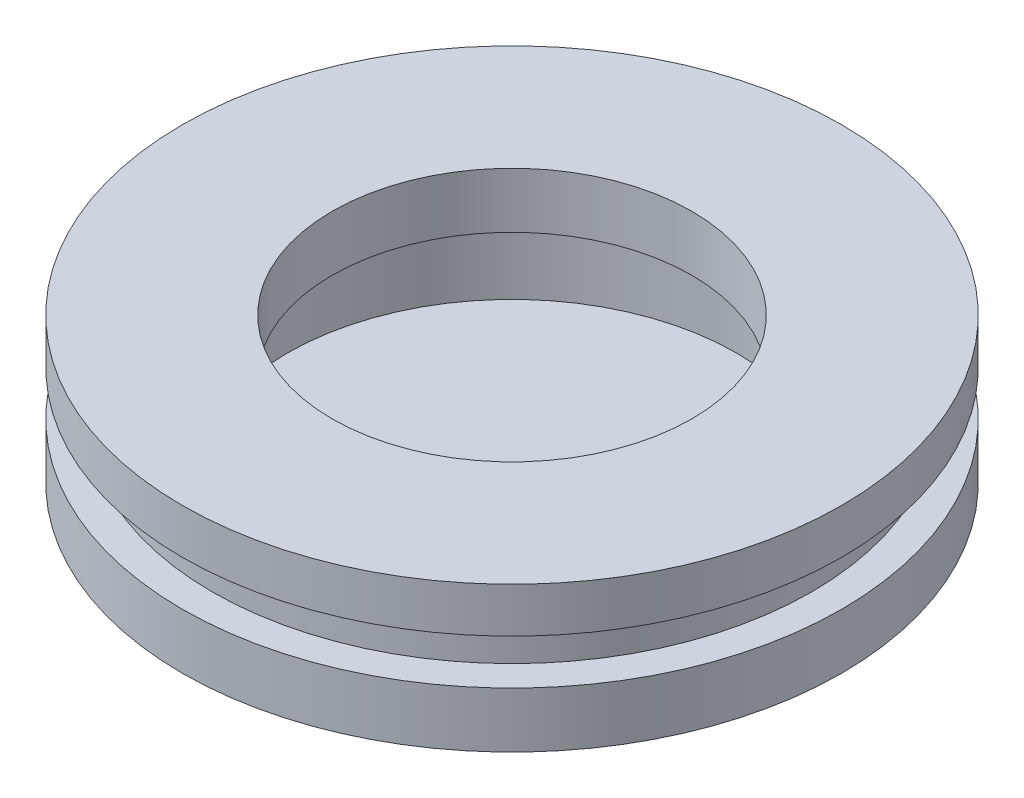
ISO-10303-21;
HEADER;
FILE_DESCRIPTION(('STEP AP214'),'2;1');
FILE_NAME('part.step','',(''),(''),'','','');
FILE_SCHEMA(('AUTOMOTIVE_DESIGN { 1 0 10303 214 1 1 1 1 }'));
ENDSEC;
DATA;
#1=APPLICATION_CONTEXT('core data for automotive mechanical design processes');
#2=APPLICATION_PROTOCOL_DEFINITION('international standard','automotive_design',2000,#1);
#3=PRODUCT_CONTEXT('',#1,'mechanical');
#4=PRODUCT('Part','Part','',(#3));
#5=PRODUCT_RELATED_PRODUCT_CATEGORY('part','',(#4));
#6=PRODUCT_DEFINITION_FORMATION('','',#4);
#7=PRODUCT_DEFINITION_CONTEXT('part definition',#1,'design');
#8=PRODUCT_DEFINITION('design','',#6,#7);
#9=PRODUCT_DEFINITION_SHAPE('','',#8);
#10=(LENGTH_UNIT() NAMED_UNIT(*) SI_UNIT(.MILLI.,.METRE.));
#11=(NAMED_UNIT(*) PLANE_ANGLE_UNIT() SI_UNIT($,.RADIAN.));
#12=(NAMED_UNIT(*) SI_UNIT($,.STERADIAN.) SOLID_ANGLE_UNIT());
#13=UNCERTAINTY_MEASURE_WITH_UNIT(LENGTH_MEASURE(1.E-05),#10,'distance_accuracy_value','');
#14=(GEOMETRIC_REPRESENTATION_CONTEXT(3) GLOBAL_UNCERTAINTY_ASSIGNED_CONTEXT((#13)) GLOBAL_UNIT_ASSIGNED_CONTEXT((#10,
#11,#12)) REPRESENTATION_CONTEXT('',''));
#15=CARTESIAN_POINT('',(0.,0.,0.));
#16=DIRECTION('',(0.,0.,1.));
#17=DIRECTION('',(1.,0.,0.));
#18=AXIS2_PLACEMENT_3D('',#15,#16,#17);
#19=CARTESIAN_POINT('',(0.,4.00367257692815,0.));
#20=DIRECTION('',(0.,1.,0.));
#21=DIRECTION('',(0.,0.,1.));
#22=AXIS2_PLACEMENT_3D('',#19,#20,#21);
#23=CONICAL_SURFACE('',#22,11.,1.22173047639604);
#24=CARTESIAN_POINT('',(0.,0.,0.));
#25=VERTEX_POINT('',#24);
#26=VERTEX_LOOP('',#25);
#27=FACE_BOUND('',#26,.T.);
#28=CARTESIAN_POINT('',(0.,4.00367257692815,0.));
#29=DIRECTION('',(0.,-1.,0.));
#30=DIRECTION('',(0.,0.,-1.));
#31=AXIS2_PLACEMENT_3D('',#28,#29,#30);
#32=CIRCLE('',#31,11.);
#33=CARTESIAN_POINT('',(0.,4.00367257692815,-11.));
#34=VERTEX_POINT('',#33);
#35=EDGE_CURVE('E55',#34,#34,#32,.T.);
#36=ORIENTED_EDGE('',*,*,#35,.T.);
#37=EDGE_LOOP('',(#36));
#38=FACE_BOUND('',#37,.T.);
#39=ADVANCED_FACE('F39',(#27,#38),#23,.T.);
#40=CARTESIAN_POINT('',(0.,8.85367257692814,0.));
#41=DIRECTION('',(0.,-1.,0.));
#42=DIRECTION('',(0.,0.,-1.));
#43=AXIS2_PLACEMENT_3D('',#40,#41,#42);
#44=PLANE('',#43);
#45=CARTESIAN_POINT('',(0.,8.85367257692814,0.));
#46=DIRECTION('',(0.,-1.,0.));
#47=DIRECTION('',(0.,0.,-1.));
#48=AXIS2_PLACEMENT_3D('',#45,#46,#47);
#49=CIRCLE('',#48,6.);
#50=CARTESIAN_POINT('',(0.,8.85367257692814,-6.));
#51=VERTEX_POINT('',#50);
#52=EDGE_CURVE('E42',#51,#51,#49,.F.);
#53=ORIENTED_EDGE('',*,*,#52,.F.);
#54=EDGE_LOOP('',(#53));
#55=FACE_BOUND('',#54,.T.);
#56=CARTESIAN_POINT('',(0.,8.85367257692814,0.));
#57=DIRECTION('',(0.,-1.,0.));
#58=DIRECTION('',(0.,0.,-1.));
#59=AXIS2_PLACEMENT_3D('',#56,#57,#58);
#60=CIRCLE('',#59,11.);
#61=CARTESIAN_POINT('',(0.,8.85367257692814,-11.));
#62=VERTEX_POINT('',#61);
#63=EDGE_CURVE('E11',#62,#62,#60,.T.);
#64=ORIENTED_EDGE('',*,*,#63,.F.);
#65=EDGE_LOOP('',(#64));
#66=FACE_BOUND('',#65,.T.);
#67=ADVANCED_FACE('F52',(#55,#66),#44,.F.);
#68=CARTESIAN_POINT('',(0.,0.,0.));
#69=DIRECTION('',(0.,-1.,0.));
#70=DIRECTION('',(0.,0.,-1.));
#71=AXIS2_PLACEMENT_3D('',#68,#69,#70);
#72=CYLINDRICAL_SURFACE('',#71,11.);
#73=CARTESIAN_POINT('',(0.,7.35367257692814,0.));
#74=DIRECTION('',(0.,-1.,0.));
#75=DIRECTION('',(0.,0.,-1.));
#76=AXIS2_PLACEMENT_3D('',#73,#74,#75);
#77=CIRCLE('',#76,11.);
#78=CARTESIAN_POINT('',(0.,7.35367257692814,-11.));
#79=VERTEX_POINT('',#78);
#80=EDGE_CURVE('E47',#79,#79,#77,.T.);
#81=ORIENTED_EDGE('',*,*,#80,.F.);
#82=EDGE_LOOP('',(#81));
#83=FACE_BOUND('',#82,.T.);
#84=ORIENTED_EDGE('',*,*,#63,.T.);
#85=EDGE_LOOP('',(#84));
#86=FACE_BOUND('',#85,.T.);
#87=ADVANCED_FACE('F83',(#83,#86),#72,.T.);
#88=CARTESIAN_POINT('',(-11.,7.35367257692814,0.));
#89=DIRECTION('',(0.,1.,0.));
#90=DIRECTION('',(0.,0.,1.));
#91=AXIS2_PLACEMENT_3D('',#88,#89,#90);
#92=PLANE('',#91);
#93=CARTESIAN_POINT('',(0.,7.35367257692815,0.));
#94=DIRECTION('',(0.,-1.,0.));
#95=DIRECTION('',(0.,0.,-1.));
#96=AXIS2_PLACEMENT_3D('',#93,#94,#95);
#97=CIRCLE('',#96,10.);
#98=CARTESIAN_POINT('',(0.,7.35367257692815,-10.));
#99=VERTEX_POINT('',#98);
#100=EDGE_CURVE('E73',#99,#99,#97,.T.);
#101=ORIENTED_EDGE('',*,*,#100,.F.);
#102=EDGE_LOOP('',(#101));
#103=FACE_BOUND('',#102,.T.);
#104=ORIENTED_EDGE('',*,*,#80,.T.);
#105=EDGE_LOOP('',(#104));
#106=FACE_BOUND('',#105,.T.);
#107=ADVANCED_FACE('F81',(#103,#106),#92,.F.);
#108=CARTESIAN_POINT('',(0.,0.,0.));
#109=DIRECTION('',(0.,-1.,0.));
#110=DIRECTION('',(0.,0.,-1.));
#111=AXIS2_PLACEMENT_3D('',#108,#109,#110);
#112=CYLINDRICAL_SURFACE('',#111,10.);
#113=CARTESIAN_POINT('',(0.,5.85367257692815,0.));
#114=DIRECTION('',(0.,-1.,0.));
#115=DIRECTION('',(0.,0.,-1.));
#116=AXIS2_PLACEMENT_3D('',#113,#114,#115);
#117=CIRCLE('',#116,10.);
#118=CARTESIAN_POINT('',(0.,5.85367257692815,-10.));
#119=VERTEX_POINT('',#118);
#120=EDGE_CURVE('E63',#119,#119,#117,.T.);
#121=ORIENTED_EDGE('',*,*,#120,.F.);
#122=EDGE_LOOP('',(#121));
#123=FACE_BOUND('',#122,.T.);
#124=ORIENTED_EDGE('',*,*,#100,.T.);
#125=EDGE_LOOP('',(#124));
#126=FACE_BOUND('',#125,.T.);
#127=ADVANCED_FACE('F97',(#123,#126),#112,.T.);
#128=CARTESIAN_POINT('',(-10.,5.85367257692815,0.));
#129=DIRECTION('',(0.,-1.,0.));
#130=DIRECTION('',(0.,0.,-1.));
#131=AXIS2_PLACEMENT_3D('',#128,#129,#130);
#132=PLANE('',#131);
#133=CARTESIAN_POINT('',(0.,5.85367257692815,0.));
#134=DIRECTION('',(0.,-1.,0.));
#135=DIRECTION('',(0.,0.,-1.));
#136=AXIS2_PLACEMENT_3D('',#133,#134,#135);
#137=CIRCLE('',#136,11.);
#138=CARTESIAN_POINT('',(0.,5.85367257692815,-11.));
#139=VERTEX_POINT('',#138);
#140=EDGE_CURVE('E58',#139,#139,#137,.T.);
#141=ORIENTED_EDGE('',*,*,#140,.F.);
#142=EDGE_LOOP('',(#141));
#143=FACE_BOUND('',#142,.T.);
#144=ORIENTED_EDGE('',*,*,#120,.T.);
#145=EDGE_LOOP('',(#144));
#146=FACE_BOUND('',#145,.T.);
#147=ADVANCED_FACE('F101',(#143,#146),#132,.F.);
#148=CARTESIAN_POINT('',(0.,0.,0.));
#149=DIRECTION('',(0.,-1.,0.));
#150=DIRECTION('',(0.,0.,-1.));
#151=AXIS2_PLACEMENT_3D('',#148,#149,#150);
#152=CYLINDRICAL_SURFACE('',#151,11.);
#153=ORIENTED_EDGE('',*,*,#35,.F.);
#154=EDGE_LOOP('',(#153));
#155=FACE_BOUND('',#154,.T.);
#156=ORIENTED_EDGE('',*,*,#140,.T.);
#157=EDGE_LOOP('',(#156));
#158=FACE_BOUND('',#157,.T.);
#159=ADVANCED_FACE('F105',(#155,#158),#152,.T.);
#160=CARTESIAN_POINT('',(0.,4.00367257692815,0.));
#161=DIRECTION('',(0.,-1.,0.));
#162=DIRECTION('',(0.,0.,-1.));
#163=AXIS2_PLACEMENT_3D('',#160,#161,#162);
#164=CYLINDRICAL_SURFACE('',#163,6.);
#165=CARTESIAN_POINT('',(0.,7.00367257692815,0.));
#166=DIRECTION('',(0.,-1.,0.));
#167=DIRECTION('',(0.,0.,-1.));
#168=AXIS2_PLACEMENT_3D('',#165,#166,#167);
#169=CIRCLE('',#168,6.);
#170=CARTESIAN_POINT('',(0.,7.00367257692815,-6.));
#171=VERTEX_POINT('',#170);
#172=EDGE_CURVE('E66',#171,#171,#169,.T.);
#173=ORIENTED_EDGE('',*,*,#172,.T.);
#174=EDGE_LOOP('',(#173));
#175=FACE_BOUND('',#174,.T.);
#176=ORIENTED_EDGE('',*,*,#52,.T.);
#177=EDGE_LOOP('',(#176));
#178=FACE_BOUND('',#177,.T.);
#179=ADVANCED_FACE('F109',(#175,#178),#164,.F.);
#180=CARTESIAN_POINT('',(-7.5,4.00367257692815,0.));
#181=DIRECTION('',(0.,1.,0.));
#182=DIRECTION('',(0.,0.,1.));
#183=AXIS2_PLACEMENT_3D('',#180,#181,#182);
#184=PLANE('',#183);
#185=CARTESIAN_POINT('',(0.,4.00367257692815,0.));
#186=DIRECTION('',(0.,-1.,0.));
#187=DIRECTION('',(0.,0.,-1.));
#188=AXIS2_PLACEMENT_3D('',#185,#186,#187);
#189=CIRCLE('',#188,7.5);
#190=CARTESIAN_POINT('',(0.,4.00367257692815,-7.5));
#191=VERTEX_POINT('',#190);
#192=EDGE_CURVE('E129',#191,#191,#189,.T.);
#193=ORIENTED_EDGE('',*,*,#192,.F.);
#194=EDGE_LOOP('',(#193));
#195=FACE_BOUND('',#194,.T.);
#196=ADVANCED_FACE('F110',(#195),#184,.T.);
#197=CARTESIAN_POINT('',(-6.,7.00367257692815,0.));
#198=DIRECTION('',(0.,-1.,0.));
#199=DIRECTION('',(0.,0.,-1.));
#200=AXIS2_PLACEMENT_3D('',#197,#198,#199);
#201=PLANE('',#200);
#202=CARTESIAN_POINT('',(0.,7.00367257692815,0.));
#203=DIRECTION('',(0.,-1.,0.));
#204=DIRECTION('',(0.,0.,-1.));
#205=AXIS2_PLACEMENT_3D('',#202,#203,#204);
#206=CIRCLE('',#205,7.5);
#207=CARTESIAN_POINT('',(0.,7.00367257692815,-7.5));
#208=VERTEX_POINT('',#207);
#209=EDGE_CURVE('E132',#208,#208,#206,.T.);
#210=ORIENTED_EDGE('',*,*,#209,.T.);
#211=EDGE_LOOP('',(#210));
#212=FACE_BOUND('',#211,.T.);
#213=ORIENTED_EDGE('',*,*,#172,.F.);
#214=EDGE_LOOP('',(#213));
#215=FACE_BOUND('',#214,.T.);
#216=ADVANCED_FACE('F113',(#212,#215),#201,.T.);
#217=CARTESIAN_POINT('',(0.,4.00367257692815,0.));
#218=DIRECTION('',(0.,-1.,0.));
#219=DIRECTION('',(0.,0.,-1.));
#220=AXIS2_PLACEMENT_3D('',#217,#218,#219);
#221=CYLINDRICAL_SURFACE('',#220,7.5);
#222=ORIENTED_EDGE('',*,*,#192,.T.);
#223=EDGE_LOOP('',(#222));
#224=FACE_BOUND('',#223,.T.);
#225=ORIENTED_EDGE('',*,*,#209,.F.);
#226=EDGE_LOOP('',(#225));
#227=FACE_BOUND('',#226,.T.);
#228=ADVANCED_FACE('F120',(#224,#227),#221,.F.);
#229=CLOSED_SHELL('',(#39,#67,#87,#107,#127,#147,#159,#179,#196,#216,#228));
#230=MANIFOLD_SOLID_BREP('B2',#229);
#231=ADVANCED_BREP_SHAPE_REPRESENTATION('',(#18,#230),#14);
#232=SHAPE_DEFINITION_REPRESENTATION(#9,#231);
ENDSEC;
END-ISO-10303-21;
